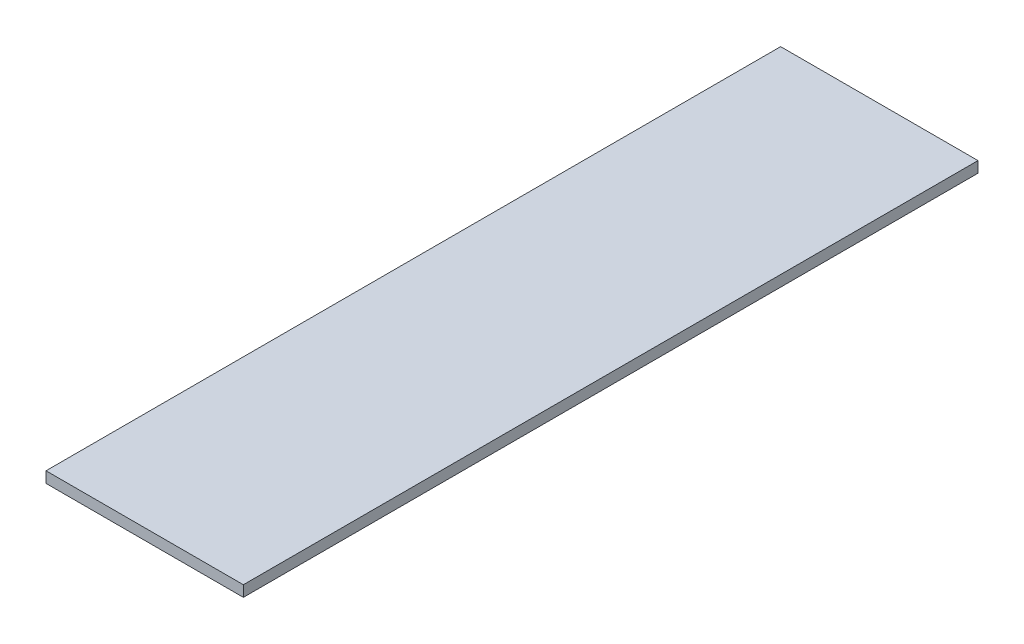
ISO-10303-21;
HEADER;
FILE_DESCRIPTION(('STEP AP214'),'2;1');
FILE_NAME('part.step','',(''),(''),'','','');
FILE_SCHEMA(('AUTOMOTIVE_DESIGN { 1 0 10303 214 1 1 1 1 }'));
ENDSEC;
DATA;
#1=APPLICATION_CONTEXT('core data for automotive mechanical design processes');
#2=APPLICATION_PROTOCOL_DEFINITION('international standard','automotive_design',2000,#1);
#3=PRODUCT_CONTEXT('',#1,'mechanical');
#4=PRODUCT('Part','Part','',(#3));
#5=PRODUCT_RELATED_PRODUCT_CATEGORY('part','',(#4));
#6=PRODUCT_DEFINITION_FORMATION('','',#4);
#7=PRODUCT_DEFINITION_CONTEXT('part definition',#1,'design');
#8=PRODUCT_DEFINITION('design','',#6,#7);
#9=PRODUCT_DEFINITION_SHAPE('','',#8);
#10=(LENGTH_UNIT() NAMED_UNIT(*) SI_UNIT(.MILLI.,.METRE.));
#11=(NAMED_UNIT(*) PLANE_ANGLE_UNIT() SI_UNIT($,.RADIAN.));
#12=(NAMED_UNIT(*) SI_UNIT($,.STERADIAN.) SOLID_ANGLE_UNIT());
#13=UNCERTAINTY_MEASURE_WITH_UNIT(LENGTH_MEASURE(1.E-05),#10,'distance_accuracy_value','');
#14=(GEOMETRIC_REPRESENTATION_CONTEXT(3) GLOBAL_UNCERTAINTY_ASSIGNED_CONTEXT((#13)) GLOBAL_UNIT_ASSIGNED_CONTEXT((#10,
#11,#12)) REPRESENTATION_CONTEXT('',''));
#15=CARTESIAN_POINT('',(0.,0.,0.));
#16=DIRECTION('',(0.,0.,1.));
#17=DIRECTION('',(1.,0.,0.));
#18=AXIS2_PLACEMENT_3D('',#15,#16,#17);
#19=CARTESIAN_POINT('',(0.,3.175,0.));
#20=DIRECTION('',(1.,0.,0.));
#21=DIRECTION('',(0.,0.,-1.));
#22=AXIS2_PLACEMENT_3D('',#19,#20,#21);
#23=PLANE('',#22);
#24=DIRECTION('',(0.,0.,1.));
#25=VECTOR('',#24,1.);
#26=CARTESIAN_POINT('',(0.,0.,0.));
#27=LINE('',#26,#25);
#28=CARTESIAN_POINT('',(0.,0.,-212.725));
#29=VERTEX_POINT('',#28);
#30=CARTESIAN_POINT('',(0.,0.,0.));
#31=VERTEX_POINT('',#30);
#32=EDGE_CURVE('E97',#29,#31,#27,.T.);
#33=ORIENTED_EDGE('',*,*,#32,.T.);
#34=DIRECTION('',(0.,-1.,0.));
#35=VECTOR('',#34,1.);
#36=CARTESIAN_POINT('',(0.,3.175,0.));
#37=LINE('',#36,#35);
#38=CARTESIAN_POINT('',(0.,3.175,0.));
#39=VERTEX_POINT('',#38);
#40=EDGE_CURVE('E11',#39,#31,#37,.T.);
#41=ORIENTED_EDGE('',*,*,#40,.F.);
#42=DIRECTION('',(0.,0.,1.));
#43=VECTOR('',#42,1.);
#44=CARTESIAN_POINT('',(0.,3.175,0.));
#45=LINE('',#44,#43);
#46=CARTESIAN_POINT('',(0.,3.175,-212.725));
#47=VERTEX_POINT('',#46);
#48=EDGE_CURVE('E85',#47,#39,#45,.T.);
#49=ORIENTED_EDGE('',*,*,#48,.F.);
#50=DIRECTION('',(0.,-1.,0.));
#51=VECTOR('',#50,1.);
#52=CARTESIAN_POINT('',(0.,3.175,-212.725));
#53=LINE('',#52,#51);
#54=EDGE_CURVE('E93',#47,#29,#53,.T.);
#55=ORIENTED_EDGE('',*,*,#54,.T.);
#56=EDGE_LOOP('',(#33,#41,#49,#55));
#57=FACE_BOUND('',#56,.T.);
#58=ADVANCED_FACE('F34',(#57),#23,.F.);
#59=CARTESIAN_POINT('',(0.,3.175,0.));
#60=DIRECTION('',(0.,0.,-1.));
#61=DIRECTION('',(-1.,0.,0.));
#62=AXIS2_PLACEMENT_3D('',#59,#60,#61);
#63=PLANE('',#62);
#64=DIRECTION('',(1.,0.,0.));
#65=VECTOR('',#64,1.);
#66=CARTESIAN_POINT('',(0.,0.,0.));
#67=LINE('',#66,#65);
#68=CARTESIAN_POINT('',(57.15,0.,0.));
#69=VERTEX_POINT('',#68);
#70=EDGE_CURVE('E89',#31,#69,#67,.T.);
#71=ORIENTED_EDGE('',*,*,#70,.T.);
#72=DIRECTION('',(0.,-1.,0.));
#73=VECTOR('',#72,1.);
#74=CARTESIAN_POINT('',(57.15,3.175,0.));
#75=LINE('',#74,#73);
#76=CARTESIAN_POINT('',(57.15,3.175,0.));
#77=VERTEX_POINT('',#76);
#78=EDGE_CURVE('E42',#77,#69,#75,.T.);
#79=ORIENTED_EDGE('',*,*,#78,.F.);
#80=DIRECTION('',(1.,0.,0.));
#81=VECTOR('',#80,1.);
#82=CARTESIAN_POINT('',(0.,3.175,0.));
#83=LINE('',#82,#81);
#84=EDGE_CURVE('E80',#39,#77,#83,.T.);
#85=ORIENTED_EDGE('',*,*,#84,.F.);
#86=ORIENTED_EDGE('',*,*,#40,.T.);
#87=EDGE_LOOP('',(#71,#79,#85,#86));
#88=FACE_BOUND('',#87,.T.);
#89=ADVANCED_FACE('F88',(#88),#63,.F.);
#90=CARTESIAN_POINT('',(57.15,3.175,0.));
#91=DIRECTION('',(-1.,0.,0.));
#92=DIRECTION('',(0.,0.,1.));
#93=AXIS2_PLACEMENT_3D('',#90,#91,#92);
#94=PLANE('',#93);
#95=DIRECTION('',(0.,0.,-1.));
#96=VECTOR('',#95,1.);
#97=CARTESIAN_POINT('',(57.15,0.,0.));
#98=LINE('',#97,#96);
#99=CARTESIAN_POINT('',(57.15,0.,-212.725));
#100=VERTEX_POINT('',#99);
#101=EDGE_CURVE('E67',#69,#100,#98,.T.);
#102=ORIENTED_EDGE('',*,*,#101,.T.);
#103=DIRECTION('',(0.,-1.,0.));
#104=VECTOR('',#103,1.);
#105=CARTESIAN_POINT('',(57.15,3.175,-212.725));
#106=LINE('',#105,#104);
#107=CARTESIAN_POINT('',(57.15,3.175,-212.725));
#108=VERTEX_POINT('',#107);
#109=EDGE_CURVE('E90',#108,#100,#106,.T.);
#110=ORIENTED_EDGE('',*,*,#109,.F.);
#111=DIRECTION('',(0.,0.,-1.));
#112=VECTOR('',#111,1.);
#113=CARTESIAN_POINT('',(57.15,3.175,0.));
#114=LINE('',#113,#112);
#115=EDGE_CURVE('E83',#77,#108,#114,.T.);
#116=ORIENTED_EDGE('',*,*,#115,.F.);
#117=ORIENTED_EDGE('',*,*,#78,.T.);
#118=EDGE_LOOP('',(#102,#110,#116,#117));
#119=FACE_BOUND('',#118,.T.);
#120=ADVANCED_FACE('F91',(#119),#94,.F.);
#121=CARTESIAN_POINT('',(0.,3.175,-212.725));
#122=DIRECTION('',(0.,0.,1.));
#123=DIRECTION('',(1.,0.,0.));
#124=AXIS2_PLACEMENT_3D('',#121,#122,#123);
#125=PLANE('',#124);
#126=DIRECTION('',(-1.,0.,0.));
#127=VECTOR('',#126,1.);
#128=CARTESIAN_POINT('',(0.,0.,-212.725));
#129=LINE('',#128,#127);
#130=EDGE_CURVE('E73',#100,#29,#129,.T.);
#131=ORIENTED_EDGE('',*,*,#130,.T.);
#132=ORIENTED_EDGE('',*,*,#54,.F.);
#133=DIRECTION('',(-1.,0.,0.));
#134=VECTOR('',#133,1.);
#135=CARTESIAN_POINT('',(0.,3.175,-212.725));
#136=LINE('',#135,#134);
#137=EDGE_CURVE('E50',#108,#47,#136,.T.);
#138=ORIENTED_EDGE('',*,*,#137,.F.);
#139=ORIENTED_EDGE('',*,*,#109,.T.);
#140=EDGE_LOOP('',(#131,#132,#138,#139));
#141=FACE_BOUND('',#140,.T.);
#142=ADVANCED_FACE('F104',(#141),#125,.F.);
#143=CARTESIAN_POINT('',(0.,3.175,0.));
#144=DIRECTION('',(0.,-1.,0.));
#145=DIRECTION('',(0.,0.,-1.));
#146=AXIS2_PLACEMENT_3D('',#143,#144,#145);
#147=PLANE('',#146);
#148=ORIENTED_EDGE('',*,*,#48,.T.);
#149=ORIENTED_EDGE('',*,*,#84,.T.);
#150=ORIENTED_EDGE('',*,*,#115,.T.);
#151=ORIENTED_EDGE('',*,*,#137,.T.);
#152=EDGE_LOOP('',(#148,#149,#150,#151));
#153=FACE_BOUND('',#152,.T.);
#154=ADVANCED_FACE('F81',(#153),#147,.F.);
#155=CARTESIAN_POINT('',(0.,0.,0.));
#156=DIRECTION('',(0.,-1.,0.));
#157=DIRECTION('',(0.,0.,-1.));
#158=AXIS2_PLACEMENT_3D('',#155,#156,#157);
#159=PLANE('',#158);
#160=ORIENTED_EDGE('',*,*,#32,.F.);
#161=ORIENTED_EDGE('',*,*,#130,.F.);
#162=ORIENTED_EDGE('',*,*,#101,.F.);
#163=ORIENTED_EDGE('',*,*,#70,.F.);
#164=EDGE_LOOP('',(#160,#161,#162,#163));
#165=FACE_BOUND('',#164,.T.);
#166=ADVANCED_FACE('F107',(#165),#159,.T.);
#167=CLOSED_SHELL('',(#58,#89,#120,#142,#154,#166));
#168=MANIFOLD_SOLID_BREP('B2',#167);
#169=ADVANCED_BREP_SHAPE_REPRESENTATION('',(#18,#168),#14);
#170=SHAPE_DEFINITION_REPRESENTATION(#9,#169);
ENDSEC;
END-ISO-10303-21;
